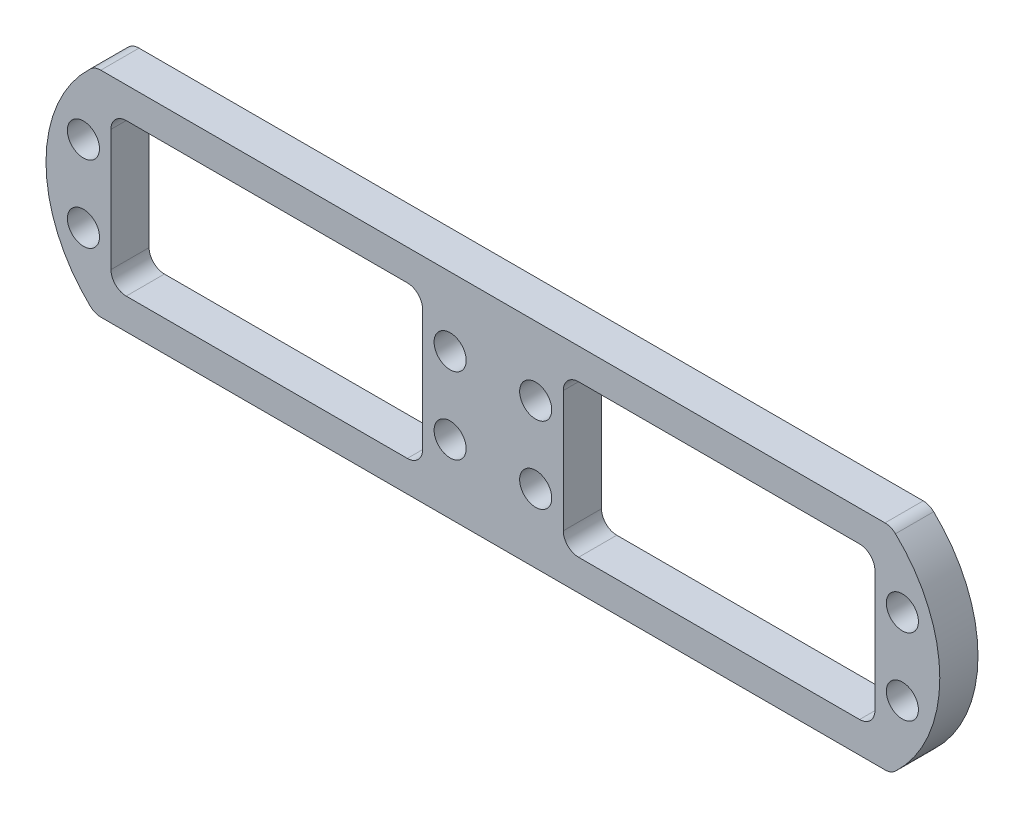
ISO-10303-21;
HEADER;
FILE_DESCRIPTION(('STEP AP214'),'2;1');
FILE_NAME('part.step','',(''),(''),'','','');
FILE_SCHEMA(('AUTOMOTIVE_DESIGN { 1 0 10303 214 1 1 1 1 }'));
ENDSEC;
DATA;
#1=APPLICATION_CONTEXT('core data for automotive mechanical design processes');
#2=APPLICATION_PROTOCOL_DEFINITION('international standard','automotive_design',2000,#1);
#3=PRODUCT_CONTEXT('',#1,'mechanical');
#4=PRODUCT('Part','Part','',(#3));
#5=PRODUCT_RELATED_PRODUCT_CATEGORY('part','',(#4));
#6=PRODUCT_DEFINITION_FORMATION('','',#4);
#7=PRODUCT_DEFINITION_CONTEXT('part definition',#1,'design');
#8=PRODUCT_DEFINITION('design','',#6,#7);
#9=PRODUCT_DEFINITION_SHAPE('','',#8);
#10=(LENGTH_UNIT() NAMED_UNIT(*) SI_UNIT(.MILLI.,.METRE.));
#11=(NAMED_UNIT(*) PLANE_ANGLE_UNIT() SI_UNIT($,.RADIAN.));
#12=(NAMED_UNIT(*) SI_UNIT($,.STERADIAN.) SOLID_ANGLE_UNIT());
#13=UNCERTAINTY_MEASURE_WITH_UNIT(LENGTH_MEASURE(1.E-05),#10,'distance_accuracy_value','');
#14=(GEOMETRIC_REPRESENTATION_CONTEXT(3) GLOBAL_UNCERTAINTY_ASSIGNED_CONTEXT((#13)) GLOBAL_UNIT_ASSIGNED_CONTEXT((#10,
#11,#12)) REPRESENTATION_CONTEXT('',''));
#15=CARTESIAN_POINT('',(0.,0.,0.));
#16=DIRECTION('',(0.,0.,1.));
#17=DIRECTION('',(1.,0.,0.));
#18=AXIS2_PLACEMENT_3D('',#15,#16,#17);
#19=CARTESIAN_POINT('',(91.3247516529062,-12.,5.));
#20=DIRECTION('',(0.,0.,-1.));
#21=DIRECTION('',(-1.,0.,0.));
#22=AXIS2_PLACEMENT_3D('',#19,#20,#21);
#23=PLANE('',#22);
#24=CARTESIAN_POINT('',(45.6000000000007,5.00000000000006,5.));
#25=DIRECTION('',(0.,0.,1.));
#26=DIRECTION('',(1.,0.,0.));
#27=AXIS2_PLACEMENT_3D('',#24,#25,#26);
#28=CIRCLE('',#27,2.1);
#29=CARTESIAN_POINT('',(47.7000000000007,5.00000000000006,5.));
#30=VERTEX_POINT('',#29);
#31=EDGE_CURVE('E701',#30,#30,#28,.T.);
#32=ORIENTED_EDGE('',*,*,#31,.F.);
#33=EDGE_LOOP('',(#32));
#34=FACE_BOUND('',#33,.T.);
#35=CARTESIAN_POINT('',(93.6000000000007,5.00000000000009,5.));
#36=DIRECTION('',(0.,0.,1.));
#37=DIRECTION('',(1.,0.,0.));
#38=AXIS2_PLACEMENT_3D('',#35,#36,#37);
#39=CIRCLE('',#38,2.1);
#40=CARTESIAN_POINT('',(95.7000000000007,5.00000000000009,5.));
#41=VERTEX_POINT('',#40);
#42=EDGE_CURVE('E713',#41,#41,#39,.T.);
#43=ORIENTED_EDGE('',*,*,#42,.F.);
#44=EDGE_LOOP('',(#43));
#45=FACE_BOUND('',#44,.T.);
#46=CARTESIAN_POINT('',(34.4,5.00000000000001,5.));
#47=DIRECTION('',(0.,0.,1.));
#48=DIRECTION('',(1.,0.,0.));
#49=AXIS2_PLACEMENT_3D('',#46,#47,#48);
#50=CIRCLE('',#49,2.1);
#51=CARTESIAN_POINT('',(36.5,5.00000000000001,5.));
#52=VERTEX_POINT('',#51);
#53=EDGE_CURVE('E725',#52,#52,#50,.T.);
#54=ORIENTED_EDGE('',*,*,#53,.F.);
#55=EDGE_LOOP('',(#54));
#56=FACE_BOUND('',#55,.T.);
#57=CARTESIAN_POINT('',(-13.6,4.99999999999998,5.));
#58=DIRECTION('',(0.,0.,1.));
#59=DIRECTION('',(1.,0.,0.));
#60=AXIS2_PLACEMENT_3D('',#57,#58,#59);
#61=CIRCLE('',#60,2.1);
#62=CARTESIAN_POINT('',(-11.5,4.99999999999998,5.));
#63=VERTEX_POINT('',#62);
#64=EDGE_CURVE('E229',#63,#63,#61,.T.);
#65=ORIENTED_EDGE('',*,*,#64,.F.);
#66=EDGE_LOOP('',(#65));
#67=FACE_BOUND('',#66,.T.);
#68=CARTESIAN_POINT('',(51.2153950105849,-7.94999999999999,5.));
#69=DIRECTION('',(0.,0.,1.));
#70=DIRECTION('',(1.,0.,0.));
#71=AXIS2_PLACEMENT_3D('',#68,#69,#70);
#72=CIRCLE('',#71,2.);
#73=CARTESIAN_POINT('',(49.2153950105849,-7.94999999999999,5.));
#74=VERTEX_POINT('',#73);
#75=CARTESIAN_POINT('',(51.2153950105849,-9.94999999999999,5.));
#76=VERTEX_POINT('',#75);
#77=EDGE_CURVE('E259',#74,#76,#72,.T.);
#78=ORIENTED_EDGE('',*,*,#77,.F.);
#79=DIRECTION('',(0.,-1.,0.));
#80=VECTOR('',#79,1.);
#81=CARTESIAN_POINT('',(49.2153950105849,7.95,5.));
#82=LINE('',#81,#80);
#83=CARTESIAN_POINT('',(49.2153950105849,7.95,5.));
#84=VERTEX_POINT('',#83);
#85=EDGE_CURVE('E275',#84,#74,#82,.T.);
#86=ORIENTED_EDGE('',*,*,#85,.F.);
#87=CARTESIAN_POINT('',(51.2153950105849,7.95,5.));
#88=DIRECTION('',(0.,0.,1.));
#89=DIRECTION('',(1.,0.,0.));
#90=AXIS2_PLACEMENT_3D('',#87,#88,#89);
#91=CIRCLE('',#90,2.);
#92=CARTESIAN_POINT('',(51.2153950105849,9.95,5.));
#93=VERTEX_POINT('',#92);
#94=EDGE_CURVE('E272',#93,#84,#91,.T.);
#95=ORIENTED_EDGE('',*,*,#94,.F.);
#96=DIRECTION('',(-1.,0.,0.));
#97=VECTOR('',#96,1.);
#98=CARTESIAN_POINT('',(51.2153950105849,9.95,5.));
#99=LINE('',#98,#97);
#100=CARTESIAN_POINT('',(88.0000000000001,9.95,5.));
#101=VERTEX_POINT('',#100);
#102=EDGE_CURVE('E270',#101,#93,#99,.T.);
#103=ORIENTED_EDGE('',*,*,#102,.F.);
#104=CARTESIAN_POINT('',(88.0000000000001,7.95,5.));
#105=DIRECTION('',(0.,0.,1.));
#106=DIRECTION('',(-1.,0.,0.));
#107=AXIS2_PLACEMENT_3D('',#104,#105,#106);
#108=CIRCLE('',#107,2.);
#109=CARTESIAN_POINT('',(90.0000000000001,7.95,5.));
#110=VERTEX_POINT('',#109);
#111=EDGE_CURVE('E268',#110,#101,#108,.T.);
#112=ORIENTED_EDGE('',*,*,#111,.F.);
#113=DIRECTION('',(0.,1.,0.));
#114=VECTOR('',#113,1.);
#115=CARTESIAN_POINT('',(90.0000000000001,7.95,5.));
#116=LINE('',#115,#114);
#117=CARTESIAN_POINT('',(90.0000000000001,-7.94999999999999,5.));
#118=VERTEX_POINT('',#117);
#119=EDGE_CURVE('E266',#118,#110,#116,.T.);
#120=ORIENTED_EDGE('',*,*,#119,.F.);
#121=CARTESIAN_POINT('',(88.0000000000001,-7.94999999999999,5.));
#122=DIRECTION('',(0.,0.,1.));
#123=DIRECTION('',(1.,0.,0.));
#124=AXIS2_PLACEMENT_3D('',#121,#122,#123);
#125=CIRCLE('',#124,2.);
#126=CARTESIAN_POINT('',(88.0000000000001,-9.94999999999999,5.));
#127=VERTEX_POINT('',#126);
#128=EDGE_CURVE('E264',#127,#118,#125,.T.);
#129=ORIENTED_EDGE('',*,*,#128,.F.);
#130=DIRECTION('',(1.,0.,0.));
#131=VECTOR('',#130,1.);
#132=CARTESIAN_POINT('',(51.2153950105849,-9.94999999999999,5.));
#133=LINE('',#132,#131);
#134=EDGE_CURVE('E261',#76,#127,#133,.T.);
#135=ORIENTED_EDGE('',*,*,#134,.F.);
#136=EDGE_LOOP('',(#78,#86,#95,#103,#112,#120,#129,#135));
#137=FACE_BOUND('',#136,.T.);
#138=CARTESIAN_POINT('',(91.3247516529062,-12.,5.));
#139=DIRECTION('',(0.,0.,1.));
#140=DIRECTION('',(-1.,0.,0.));
#141=AXIS2_PLACEMENT_3D('',#138,#139,#140);
#142=CIRCLE('',#141,2.);
#143=CARTESIAN_POINT('',(91.3247516529062,-14.,5.));
#144=VERTEX_POINT('',#143);
#145=CARTESIAN_POINT('',(92.6974488229554,-13.4545454545454,5.));
#146=VERTEX_POINT('',#145);
#147=EDGE_CURVE('E318',#144,#146,#142,.T.);
#148=ORIENTED_EDGE('',*,*,#147,.T.);
#149=CARTESIAN_POINT('',(80.,0.,5.));
#150=DIRECTION('',(0.,0.,1.));
#151=DIRECTION('',(-1.,0.,0.));
#152=AXIS2_PLACEMENT_3D('',#149,#150,#151);
#153=CIRCLE('',#152,18.5);
#154=CARTESIAN_POINT('',(92.6974488229554,13.4545454545454,5.));
#155=VERTEX_POINT('',#154);
#156=EDGE_CURVE('E321',#146,#155,#153,.T.);
#157=ORIENTED_EDGE('',*,*,#156,.T.);
#158=CARTESIAN_POINT('',(91.3247516529062,12.,5.));
#159=DIRECTION('',(0.,0.,1.));
#160=DIRECTION('',(-1.,0.,0.));
#161=AXIS2_PLACEMENT_3D('',#158,#159,#160);
#162=CIRCLE('',#161,2.);
#163=CARTESIAN_POINT('',(91.3247516529062,14.,5.));
#164=VERTEX_POINT('',#163);
#165=EDGE_CURVE('E324',#155,#164,#162,.T.);
#166=ORIENTED_EDGE('',*,*,#165,.T.);
#167=DIRECTION('',(-1.,0.,0.));
#168=VECTOR('',#167,1.);
#169=CARTESIAN_POINT('',(-11.3247516529062,14.,5.));
#170=LINE('',#169,#168);
#171=CARTESIAN_POINT('',(-11.3247516529062,14.,5.));
#172=VERTEX_POINT('',#171);
#173=EDGE_CURVE('E326',#164,#172,#170,.T.);
#174=ORIENTED_EDGE('',*,*,#173,.T.);
#175=CARTESIAN_POINT('',(-11.3247516529062,12.,5.));
#176=DIRECTION('',(0.,0.,1.));
#177=DIRECTION('',(1.,0.,0.));
#178=AXIS2_PLACEMENT_3D('',#175,#176,#177);
#179=CIRCLE('',#178,2.);
#180=CARTESIAN_POINT('',(-12.6974488229554,13.4545454545454,5.));
#181=VERTEX_POINT('',#180);
#182=EDGE_CURVE('E328',#172,#181,#179,.T.);
#183=ORIENTED_EDGE('',*,*,#182,.T.);
#184=CARTESIAN_POINT('',(0.,0.,5.));
#185=DIRECTION('',(0.,0.,1.));
#186=DIRECTION('',(-1.,0.,0.));
#187=AXIS2_PLACEMENT_3D('',#184,#185,#186);
#188=CIRCLE('',#187,18.5);
#189=CARTESIAN_POINT('',(-12.6974488229554,-13.4545454545455,5.));
#190=VERTEX_POINT('',#189);
#191=EDGE_CURVE('E330',#181,#190,#188,.T.);
#192=ORIENTED_EDGE('',*,*,#191,.T.);
#193=CARTESIAN_POINT('',(-11.3247516529061,-12.,5.));
#194=DIRECTION('',(0.,0.,1.));
#195=DIRECTION('',(-1.,0.,0.));
#196=AXIS2_PLACEMENT_3D('',#193,#194,#195);
#197=CIRCLE('',#196,2.);
#198=CARTESIAN_POINT('',(-11.3247516529061,-14.,5.));
#199=VERTEX_POINT('',#198);
#200=EDGE_CURVE('E332',#190,#199,#197,.T.);
#201=ORIENTED_EDGE('',*,*,#200,.T.);
#202=DIRECTION('',(1.,0.,0.));
#203=VECTOR('',#202,1.);
#204=CARTESIAN_POINT('',(91.3247516529062,-14.,5.));
#205=LINE('',#204,#203);
#206=EDGE_CURVE('E334',#199,#144,#205,.T.);
#207=ORIENTED_EDGE('',*,*,#206,.T.);
#208=EDGE_LOOP('',(#148,#157,#166,#174,#183,#192,#201,#207));
#209=FACE_BOUND('',#208,.T.);
#210=CARTESIAN_POINT('',(-7.99999999999995,7.95000000000001,5.));
#211=DIRECTION('',(0.,0.,1.));
#212=DIRECTION('',(1.,0.,0.));
#213=AXIS2_PLACEMENT_3D('',#210,#211,#212);
#214=CIRCLE('',#213,2.);
#215=CARTESIAN_POINT('',(-7.99999999999995,9.95000000000001,5.));
#216=VERTEX_POINT('',#215);
#217=CARTESIAN_POINT('',(-9.99999999999995,7.95000000000001,5.));
#218=VERTEX_POINT('',#217);
#219=EDGE_CURVE('E191',#216,#218,#214,.T.);
#220=ORIENTED_EDGE('',*,*,#219,.F.);
#221=DIRECTION('',(-1.,0.,0.));
#222=VECTOR('',#221,1.);
#223=CARTESIAN_POINT('',(-7.99999999999995,9.95000000000001,5.));
#224=LINE('',#223,#222);
#225=CARTESIAN_POINT('',(28.8,9.95000000000001,5.));
#226=VERTEX_POINT('',#225);
#227=EDGE_CURVE('E226',#226,#216,#224,.T.);
#228=ORIENTED_EDGE('',*,*,#227,.F.);
#229=CARTESIAN_POINT('',(28.8,7.95000000000001,5.));
#230=DIRECTION('',(0.,0.,1.));
#231=DIRECTION('',(-1.,0.,0.));
#232=AXIS2_PLACEMENT_3D('',#229,#230,#231);
#233=CIRCLE('',#232,2.);
#234=CARTESIAN_POINT('',(30.8,7.95000000000001,5.));
#235=VERTEX_POINT('',#234);
#236=EDGE_CURVE('E224',#235,#226,#233,.T.);
#237=ORIENTED_EDGE('',*,*,#236,.F.);
#238=DIRECTION('',(0.,1.,0.));
#239=VECTOR('',#238,1.);
#240=CARTESIAN_POINT('',(30.8,7.95000000000001,5.));
#241=LINE('',#240,#239);
#242=CARTESIAN_POINT('',(30.8,-7.94999999999999,5.));
#243=VERTEX_POINT('',#242);
#244=EDGE_CURVE('E222',#243,#235,#241,.T.);
#245=ORIENTED_EDGE('',*,*,#244,.F.);
#246=CARTESIAN_POINT('',(28.8,-7.94999999999999,5.));
#247=DIRECTION('',(0.,0.,1.));
#248=DIRECTION('',(1.,0.,0.));
#249=AXIS2_PLACEMENT_3D('',#246,#247,#248);
#250=CIRCLE('',#249,2.);
#251=CARTESIAN_POINT('',(28.8,-9.94999999999999,5.));
#252=VERTEX_POINT('',#251);
#253=EDGE_CURVE('E220',#252,#243,#250,.T.);
#254=ORIENTED_EDGE('',*,*,#253,.F.);
#255=DIRECTION('',(1.,0.,0.));
#256=VECTOR('',#255,1.);
#257=CARTESIAN_POINT('',(-7.99999999999995,-9.94999999999999,5.));
#258=LINE('',#257,#256);
#259=CARTESIAN_POINT('',(-7.99999999999995,-9.94999999999999,5.));
#260=VERTEX_POINT('',#259);
#261=EDGE_CURVE('E215',#260,#252,#258,.T.);
#262=ORIENTED_EDGE('',*,*,#261,.F.);
#263=CARTESIAN_POINT('',(-7.99999999999995,-7.94999999999999,5.));
#264=DIRECTION('',(0.,0.,1.));
#265=DIRECTION('',(1.,0.,0.));
#266=AXIS2_PLACEMENT_3D('',#263,#264,#265);
#267=CIRCLE('',#266,2.);
#268=CARTESIAN_POINT('',(-9.99999999999995,-7.94999999999999,5.));
#269=VERTEX_POINT('',#268);
#270=EDGE_CURVE('E213',#269,#260,#267,.T.);
#271=ORIENTED_EDGE('',*,*,#270,.F.);
#272=DIRECTION('',(0.,-1.,0.));
#273=VECTOR('',#272,1.);
#274=CARTESIAN_POINT('',(-9.99999999999995,7.95000000000001,5.));
#275=LINE('',#274,#273);
#276=EDGE_CURVE('E199',#218,#269,#275,.T.);
#277=ORIENTED_EDGE('',*,*,#276,.F.);
#278=EDGE_LOOP('',(#220,#228,#237,#245,#254,#262,#271,#277));
#279=FACE_BOUND('',#278,.T.);
#280=CARTESIAN_POINT('',(45.6000000000007,-4.99999999999996,5.));
#281=DIRECTION('',(0.,0.,1.));
#282=DIRECTION('',(1.,0.,0.));
#283=AXIS2_PLACEMENT_3D('',#280,#281,#282);
#284=CIRCLE('',#283,2.1);
#285=CARTESIAN_POINT('',(47.7000000000007,-4.99999999999996,5.));
#286=VERTEX_POINT('',#285);
#287=EDGE_CURVE('E731',#286,#286,#284,.T.);
#288=ORIENTED_EDGE('',*,*,#287,.F.);
#289=EDGE_LOOP('',(#288));
#290=FACE_BOUND('',#289,.T.);
#291=CARTESIAN_POINT('',(-13.6,-5.00000000000002,5.));
#292=DIRECTION('',(0.,0.,1.));
#293=DIRECTION('',(1.,0.,0.));
#294=AXIS2_PLACEMENT_3D('',#291,#292,#293);
#295=CIRCLE('',#294,2.1);
#296=CARTESIAN_POINT('',(-11.5,-5.00000000000002,5.));
#297=VERTEX_POINT('',#296);
#298=EDGE_CURVE('E719',#297,#297,#295,.T.);
#299=ORIENTED_EDGE('',*,*,#298,.F.);
#300=EDGE_LOOP('',(#299));
#301=FACE_BOUND('',#300,.T.);
#302=CARTESIAN_POINT('',(93.6000000000007,-4.99999999999991,5.));
#303=DIRECTION('',(0.,0.,1.));
#304=DIRECTION('',(1.,0.,0.));
#305=AXIS2_PLACEMENT_3D('',#302,#303,#304);
#306=CIRCLE('',#305,2.1);
#307=CARTESIAN_POINT('',(95.7000000000008,-4.99999999999991,5.));
#308=VERTEX_POINT('',#307);
#309=EDGE_CURVE('E707',#308,#308,#306,.T.);
#310=ORIENTED_EDGE('',*,*,#309,.F.);
#311=EDGE_LOOP('',(#310));
#312=FACE_BOUND('',#311,.T.);
#313=CARTESIAN_POINT('',(34.4,-5.00000000000002,5.));
#314=DIRECTION('',(0.,0.,1.));
#315=DIRECTION('',(1.,0.,0.));
#316=AXIS2_PLACEMENT_3D('',#313,#314,#315);
#317=CIRCLE('',#316,2.1);
#318=CARTESIAN_POINT('',(36.5,-5.00000000000002,5.));
#319=VERTEX_POINT('',#318);
#320=EDGE_CURVE('E692',#319,#319,#317,.T.);
#321=ORIENTED_EDGE('',*,*,#320,.F.);
#322=EDGE_LOOP('',(#321));
#323=FACE_BOUND('',#322,.T.);
#324=ADVANCED_FACE('F30',(#34,#45,#56,#67,#137,#209,#279,#290,#301,#312,#323),#23,.F.);
#325=CARTESIAN_POINT('',(91.3247516529062,-12.,0.));
#326=DIRECTION('',(0.,0.,-1.));
#327=DIRECTION('',(-1.,0.,0.));
#328=AXIS2_PLACEMENT_3D('',#325,#326,#327);
#329=PLANE('',#328);
#330=CARTESIAN_POINT('',(45.6000000000007,5.00000000000006,0.));
#331=DIRECTION('',(0.,0.,1.));
#332=DIRECTION('',(1.,0.,0.));
#333=AXIS2_PLACEMENT_3D('',#330,#331,#332);
#334=CIRCLE('',#333,2.1);
#335=CARTESIAN_POINT('',(47.7000000000007,5.00000000000006,0.));
#336=VERTEX_POINT('',#335);
#337=EDGE_CURVE('E698',#336,#336,#334,.T.);
#338=ORIENTED_EDGE('',*,*,#337,.T.);
#339=EDGE_LOOP('',(#338));
#340=FACE_BOUND('',#339,.T.);
#341=CARTESIAN_POINT('',(93.6000000000007,5.00000000000009,0.));
#342=DIRECTION('',(0.,0.,1.));
#343=DIRECTION('',(1.,0.,0.));
#344=AXIS2_PLACEMENT_3D('',#341,#342,#343);
#345=CIRCLE('',#344,2.1);
#346=CARTESIAN_POINT('',(95.7000000000007,5.00000000000009,0.));
#347=VERTEX_POINT('',#346);
#348=EDGE_CURVE('E710',#347,#347,#345,.T.);
#349=ORIENTED_EDGE('',*,*,#348,.T.);
#350=EDGE_LOOP('',(#349));
#351=FACE_BOUND('',#350,.T.);
#352=CARTESIAN_POINT('',(34.4,5.00000000000001,0.));
#353=DIRECTION('',(0.,0.,1.));
#354=DIRECTION('',(1.,0.,0.));
#355=AXIS2_PLACEMENT_3D('',#352,#353,#354);
#356=CIRCLE('',#355,2.1);
#357=CARTESIAN_POINT('',(36.5,5.00000000000001,0.));
#358=VERTEX_POINT('',#357);
#359=EDGE_CURVE('E722',#358,#358,#356,.T.);
#360=ORIENTED_EDGE('',*,*,#359,.T.);
#361=EDGE_LOOP('',(#360));
#362=FACE_BOUND('',#361,.T.);
#363=CARTESIAN_POINT('',(-13.6,4.99999999999998,0.));
#364=DIRECTION('',(0.,0.,1.));
#365=DIRECTION('',(1.,0.,0.));
#366=AXIS2_PLACEMENT_3D('',#363,#364,#365);
#367=CIRCLE('',#366,2.1);
#368=CARTESIAN_POINT('',(-11.5,4.99999999999998,0.));
#369=VERTEX_POINT('',#368);
#370=EDGE_CURVE('E734',#369,#369,#367,.T.);
#371=ORIENTED_EDGE('',*,*,#370,.T.);
#372=EDGE_LOOP('',(#371));
#373=FACE_BOUND('',#372,.T.);
#374=DIRECTION('',(0.,-1.,0.));
#375=VECTOR('',#374,1.);
#376=CARTESIAN_POINT('',(49.2153950105849,7.95,0.));
#377=LINE('',#376,#375);
#378=CARTESIAN_POINT('',(49.2153950105849,7.95,0.));
#379=VERTEX_POINT('',#378);
#380=CARTESIAN_POINT('',(49.2153950105849,-7.94999999999999,0.));
#381=VERTEX_POINT('',#380);
#382=EDGE_CURVE('E262',#379,#381,#377,.T.);
#383=ORIENTED_EDGE('',*,*,#382,.T.);
#384=CARTESIAN_POINT('',(51.2153950105849,-7.94999999999999,0.));
#385=DIRECTION('',(0.,0.,1.));
#386=DIRECTION('',(1.,0.,0.));
#387=AXIS2_PLACEMENT_3D('',#384,#385,#386);
#388=CIRCLE('',#387,2.);
#389=CARTESIAN_POINT('',(51.2153950105849,-9.94999999999999,0.));
#390=VERTEX_POINT('',#389);
#391=EDGE_CURVE('E207',#381,#390,#388,.T.);
#392=ORIENTED_EDGE('',*,*,#391,.T.);
#393=DIRECTION('',(1.,0.,0.));
#394=VECTOR('',#393,1.);
#395=CARTESIAN_POINT('',(51.2153950105849,-9.94999999999999,0.));
#396=LINE('',#395,#394);
#397=CARTESIAN_POINT('',(88.0000000000001,-9.94999999999999,0.));
#398=VERTEX_POINT('',#397);
#399=EDGE_CURVE('E280',#390,#398,#396,.T.);
#400=ORIENTED_EDGE('',*,*,#399,.T.);
#401=CARTESIAN_POINT('',(88.0000000000001,-7.94999999999999,0.));
#402=DIRECTION('',(0.,0.,1.));
#403=DIRECTION('',(1.,0.,0.));
#404=AXIS2_PLACEMENT_3D('',#401,#402,#403);
#405=CIRCLE('',#404,2.);
#406=CARTESIAN_POINT('',(90.0000000000001,-7.94999999999999,0.));
#407=VERTEX_POINT('',#406);
#408=EDGE_CURVE('E283',#398,#407,#405,.T.);
#409=ORIENTED_EDGE('',*,*,#408,.T.);
#410=DIRECTION('',(0.,1.,0.));
#411=VECTOR('',#410,1.);
#412=CARTESIAN_POINT('',(90.0000000000001,7.95,0.));
#413=LINE('',#412,#411);
#414=CARTESIAN_POINT('',(90.0000000000001,7.95,0.));
#415=VERTEX_POINT('',#414);
#416=EDGE_CURVE('E286',#407,#415,#413,.T.);
#417=ORIENTED_EDGE('',*,*,#416,.T.);
#418=CARTESIAN_POINT('',(88.0000000000001,7.95,0.));
#419=DIRECTION('',(0.,0.,1.));
#420=DIRECTION('',(-1.,0.,0.));
#421=AXIS2_PLACEMENT_3D('',#418,#419,#420);
#422=CIRCLE('',#421,2.);
#423=CARTESIAN_POINT('',(88.0000000000001,9.95,0.));
#424=VERTEX_POINT('',#423);
#425=EDGE_CURVE('E289',#415,#424,#422,.T.);
#426=ORIENTED_EDGE('',*,*,#425,.T.);
#427=DIRECTION('',(-1.,0.,0.));
#428=VECTOR('',#427,1.);
#429=CARTESIAN_POINT('',(51.2153950105849,9.95,0.));
#430=LINE('',#429,#428);
#431=CARTESIAN_POINT('',(51.2153950105849,9.95,0.));
#432=VERTEX_POINT('',#431);
#433=EDGE_CURVE('E292',#424,#432,#430,.T.);
#434=ORIENTED_EDGE('',*,*,#433,.T.);
#435=CARTESIAN_POINT('',(51.2153950105849,7.95,0.));
#436=DIRECTION('',(0.,0.,1.));
#437=DIRECTION('',(1.,0.,0.));
#438=AXIS2_PLACEMENT_3D('',#435,#436,#437);
#439=CIRCLE('',#438,2.);
#440=EDGE_CURVE('E295',#432,#379,#439,.T.);
#441=ORIENTED_EDGE('',*,*,#440,.T.);
#442=EDGE_LOOP('',(#383,#392,#400,#409,#417,#426,#434,#441));
#443=FACE_BOUND('',#442,.T.);
#444=CARTESIAN_POINT('',(91.3247516529062,-12.,0.));
#445=DIRECTION('',(0.,0.,1.));
#446=DIRECTION('',(-1.,0.,0.));
#447=AXIS2_PLACEMENT_3D('',#444,#445,#446);
#448=CIRCLE('',#447,2.);
#449=CARTESIAN_POINT('',(91.3247516529062,-14.,0.));
#450=VERTEX_POINT('',#449);
#451=CARTESIAN_POINT('',(92.6974488229554,-13.4545454545454,0.));
#452=VERTEX_POINT('',#451);
#453=EDGE_CURVE('E317',#450,#452,#448,.T.);
#454=ORIENTED_EDGE('',*,*,#453,.F.);
#455=DIRECTION('',(1.,0.,0.));
#456=VECTOR('',#455,1.);
#457=CARTESIAN_POINT('',(91.3247516529062,-14.,0.));
#458=LINE('',#457,#456);
#459=CARTESIAN_POINT('',(-11.3247516529061,-14.,0.));
#460=VERTEX_POINT('',#459);
#461=EDGE_CURVE('E322',#460,#450,#458,.T.);
#462=ORIENTED_EDGE('',*,*,#461,.F.);
#463=CARTESIAN_POINT('',(-11.3247516529061,-12.,0.));
#464=DIRECTION('',(0.,0.,1.));
#465=DIRECTION('',(-1.,0.,0.));
#466=AXIS2_PLACEMENT_3D('',#463,#464,#465);
#467=CIRCLE('',#466,2.);
#468=CARTESIAN_POINT('',(-12.6974488229554,-13.4545454545455,0.));
#469=VERTEX_POINT('',#468);
#470=EDGE_CURVE('E349',#469,#460,#467,.T.);
#471=ORIENTED_EDGE('',*,*,#470,.F.);
#472=CARTESIAN_POINT('',(0.,0.,0.));
#473=DIRECTION('',(0.,0.,1.));
#474=DIRECTION('',(-1.,0.,0.));
#475=AXIS2_PLACEMENT_3D('',#472,#473,#474);
#476=CIRCLE('',#475,18.5);
#477=CARTESIAN_POINT('',(-12.6974488229554,13.4545454545454,0.));
#478=VERTEX_POINT('',#477);
#479=EDGE_CURVE('E347',#478,#469,#476,.T.);
#480=ORIENTED_EDGE('',*,*,#479,.F.);
#481=CARTESIAN_POINT('',(-11.3247516529062,12.,0.));
#482=DIRECTION('',(0.,0.,1.));
#483=DIRECTION('',(1.,0.,0.));
#484=AXIS2_PLACEMENT_3D('',#481,#482,#483);
#485=CIRCLE('',#484,2.);
#486=CARTESIAN_POINT('',(-11.3247516529062,14.,0.));
#487=VERTEX_POINT('',#486);
#488=EDGE_CURVE('E345',#487,#478,#485,.T.);
#489=ORIENTED_EDGE('',*,*,#488,.F.);
#490=DIRECTION('',(-1.,0.,0.));
#491=VECTOR('',#490,1.);
#492=CARTESIAN_POINT('',(-11.3247516529062,14.,0.));
#493=LINE('',#492,#491);
#494=CARTESIAN_POINT('',(91.3247516529062,14.,0.));
#495=VERTEX_POINT('',#494);
#496=EDGE_CURVE('E343',#495,#487,#493,.T.);
#497=ORIENTED_EDGE('',*,*,#496,.F.);
#498=CARTESIAN_POINT('',(91.3247516529062,12.,0.));
#499=DIRECTION('',(0.,0.,1.));
#500=DIRECTION('',(-1.,0.,0.));
#501=AXIS2_PLACEMENT_3D('',#498,#499,#500);
#502=CIRCLE('',#501,2.);
#503=CARTESIAN_POINT('',(92.6974488229554,13.4545454545454,0.));
#504=VERTEX_POINT('',#503);
#505=EDGE_CURVE('E341',#504,#495,#502,.T.);
#506=ORIENTED_EDGE('',*,*,#505,.F.);
#507=CARTESIAN_POINT('',(80.,0.,0.));
#508=DIRECTION('',(0.,0.,1.));
#509=DIRECTION('',(-1.,0.,0.));
#510=AXIS2_PLACEMENT_3D('',#507,#508,#509);
#511=CIRCLE('',#510,18.5);
#512=EDGE_CURVE('E339',#452,#504,#511,.T.);
#513=ORIENTED_EDGE('',*,*,#512,.F.);
#514=EDGE_LOOP('',(#454,#462,#471,#480,#489,#497,#506,#513));
#515=FACE_BOUND('',#514,.T.);
#516=DIRECTION('',(-1.,0.,0.));
#517=VECTOR('',#516,1.);
#518=CARTESIAN_POINT('',(-7.99999999999995,9.95000000000001,0.));
#519=LINE('',#518,#517);
#520=CARTESIAN_POINT('',(28.8,9.95000000000001,0.));
#521=VERTEX_POINT('',#520);
#522=CARTESIAN_POINT('',(-7.99999999999995,9.95000000000001,0.));
#523=VERTEX_POINT('',#522);
#524=EDGE_CURVE('E200',#521,#523,#519,.T.);
#525=ORIENTED_EDGE('',*,*,#524,.T.);
#526=CARTESIAN_POINT('',(-7.99999999999995,7.95000000000001,0.));
#527=DIRECTION('',(0.,0.,1.));
#528=DIRECTION('',(1.,0.,0.));
#529=AXIS2_PLACEMENT_3D('',#526,#527,#528);
#530=CIRCLE('',#529,2.);
#531=CARTESIAN_POINT('',(-9.99999999999995,7.95000000000001,0.));
#532=VERTEX_POINT('',#531);
#533=EDGE_CURVE('E53',#523,#532,#530,.T.);
#534=ORIENTED_EDGE('',*,*,#533,.T.);
#535=DIRECTION('',(0.,-1.,0.));
#536=VECTOR('',#535,1.);
#537=CARTESIAN_POINT('',(-9.99999999999995,7.95000000000001,0.));
#538=LINE('',#537,#536);
#539=CARTESIAN_POINT('',(-9.99999999999995,-7.94999999999999,0.));
#540=VERTEX_POINT('',#539);
#541=EDGE_CURVE('E206',#532,#540,#538,.T.);
#542=ORIENTED_EDGE('',*,*,#541,.T.);
#543=CARTESIAN_POINT('',(-7.99999999999995,-7.94999999999999,0.));
#544=DIRECTION('',(0.,0.,1.));
#545=DIRECTION('',(1.,0.,0.));
#546=AXIS2_PLACEMENT_3D('',#543,#544,#545);
#547=CIRCLE('',#546,2.);
#548=CARTESIAN_POINT('',(-7.99999999999995,-9.94999999999999,0.));
#549=VERTEX_POINT('',#548);
#550=EDGE_CURVE('E231',#540,#549,#547,.T.);
#551=ORIENTED_EDGE('',*,*,#550,.T.);
#552=DIRECTION('',(1.,0.,0.));
#553=VECTOR('',#552,1.);
#554=CARTESIAN_POINT('',(-7.99999999999995,-9.94999999999999,0.));
#555=LINE('',#554,#553);
#556=CARTESIAN_POINT('',(28.8,-9.94999999999999,0.));
#557=VERTEX_POINT('',#556);
#558=EDGE_CURVE('E234',#549,#557,#555,.T.);
#559=ORIENTED_EDGE('',*,*,#558,.T.);
#560=CARTESIAN_POINT('',(28.8,-7.94999999999999,0.));
#561=DIRECTION('',(0.,0.,1.));
#562=DIRECTION('',(1.,0.,0.));
#563=AXIS2_PLACEMENT_3D('',#560,#561,#562);
#564=CIRCLE('',#563,2.);
#565=CARTESIAN_POINT('',(30.8,-7.94999999999999,0.));
#566=VERTEX_POINT('',#565);
#567=EDGE_CURVE('E237',#557,#566,#564,.T.);
#568=ORIENTED_EDGE('',*,*,#567,.T.);
#569=DIRECTION('',(0.,1.,0.));
#570=VECTOR('',#569,1.);
#571=CARTESIAN_POINT('',(30.8,7.95000000000001,0.));
#572=LINE('',#571,#570);
#573=CARTESIAN_POINT('',(30.8,7.95000000000001,0.));
#574=VERTEX_POINT('',#573);
#575=EDGE_CURVE('E240',#566,#574,#572,.T.);
#576=ORIENTED_EDGE('',*,*,#575,.T.);
#577=CARTESIAN_POINT('',(28.8,7.95000000000001,0.));
#578=DIRECTION('',(0.,0.,1.));
#579=DIRECTION('',(-1.,0.,0.));
#580=AXIS2_PLACEMENT_3D('',#577,#578,#579);
#581=CIRCLE('',#580,2.);
#582=EDGE_CURVE('E243',#574,#521,#581,.T.);
#583=ORIENTED_EDGE('',*,*,#582,.T.);
#584=EDGE_LOOP('',(#525,#534,#542,#551,#559,#568,#576,#583));
#585=FACE_BOUND('',#584,.T.);
#586=CARTESIAN_POINT('',(45.6000000000007,-4.99999999999996,0.));
#587=DIRECTION('',(0.,0.,1.));
#588=DIRECTION('',(1.,0.,0.));
#589=AXIS2_PLACEMENT_3D('',#586,#587,#588);
#590=CIRCLE('',#589,2.1);
#591=CARTESIAN_POINT('',(47.7000000000007,-4.99999999999996,0.));
#592=VERTEX_POINT('',#591);
#593=EDGE_CURVE('E728',#592,#592,#590,.T.);
#594=ORIENTED_EDGE('',*,*,#593,.T.);
#595=EDGE_LOOP('',(#594));
#596=FACE_BOUND('',#595,.T.);
#597=CARTESIAN_POINT('',(-13.6,-5.00000000000002,0.));
#598=DIRECTION('',(0.,0.,1.));
#599=DIRECTION('',(1.,0.,0.));
#600=AXIS2_PLACEMENT_3D('',#597,#598,#599);
#601=CIRCLE('',#600,2.1);
#602=CARTESIAN_POINT('',(-11.5,-5.00000000000002,0.));
#603=VERTEX_POINT('',#602);
#604=EDGE_CURVE('E716',#603,#603,#601,.T.);
#605=ORIENTED_EDGE('',*,*,#604,.T.);
#606=EDGE_LOOP('',(#605));
#607=FACE_BOUND('',#606,.T.);
#608=CARTESIAN_POINT('',(93.6000000000007,-4.99999999999991,0.));
#609=DIRECTION('',(0.,0.,1.));
#610=DIRECTION('',(1.,0.,0.));
#611=AXIS2_PLACEMENT_3D('',#608,#609,#610);
#612=CIRCLE('',#611,2.1);
#613=CARTESIAN_POINT('',(95.7000000000008,-4.99999999999991,0.));
#614=VERTEX_POINT('',#613);
#615=EDGE_CURVE('E704',#614,#614,#612,.T.);
#616=ORIENTED_EDGE('',*,*,#615,.T.);
#617=EDGE_LOOP('',(#616));
#618=FACE_BOUND('',#617,.T.);
#619=CARTESIAN_POINT('',(34.4,-5.00000000000002,0.));
#620=DIRECTION('',(0.,0.,1.));
#621=DIRECTION('',(1.,0.,0.));
#622=AXIS2_PLACEMENT_3D('',#619,#620,#621);
#623=CIRCLE('',#622,2.1);
#624=CARTESIAN_POINT('',(36.5,-5.00000000000002,0.));
#625=VERTEX_POINT('',#624);
#626=EDGE_CURVE('E695',#625,#625,#623,.T.);
#627=ORIENTED_EDGE('',*,*,#626,.T.);
#628=EDGE_LOOP('',(#627));
#629=FACE_BOUND('',#628,.T.);
#630=ADVANCED_FACE('F379',(#340,#351,#362,#373,#443,#515,#585,#596,#607,#618,#629),#329,.T.);
#631=CARTESIAN_POINT('',(91.3247516529062,-12.,5.));
#632=DIRECTION('',(0.,0.,-1.));
#633=DIRECTION('',(-1.,0.,0.));
#634=AXIS2_PLACEMENT_3D('',#631,#632,#633);
#635=CYLINDRICAL_SURFACE('',#634,2.);
#636=ORIENTED_EDGE('',*,*,#453,.T.);
#637=DIRECTION('',(0.,0.,-1.));
#638=VECTOR('',#637,1.);
#639=CARTESIAN_POINT('',(92.6974488229554,-13.4545454545454,5.));
#640=LINE('',#639,#638);
#641=EDGE_CURVE('E11',#146,#452,#640,.T.);
#642=ORIENTED_EDGE('',*,*,#641,.F.);
#643=ORIENTED_EDGE('',*,*,#147,.F.);
#644=DIRECTION('',(0.,0.,-1.));
#645=VECTOR('',#644,1.);
#646=CARTESIAN_POINT('',(91.3247516529062,-14.,5.));
#647=LINE('',#646,#645);
#648=EDGE_CURVE('E336',#144,#450,#647,.T.);
#649=ORIENTED_EDGE('',*,*,#648,.T.);
#650=EDGE_LOOP('',(#636,#642,#643,#649));
#651=FACE_BOUND('',#650,.T.);
#652=ADVANCED_FACE('F32',(#651),#635,.T.);
#653=CARTESIAN_POINT('',(80.,0.,5.));
#654=DIRECTION('',(0.,0.,-1.));
#655=DIRECTION('',(-1.,0.,0.));
#656=AXIS2_PLACEMENT_3D('',#653,#654,#655);
#657=CYLINDRICAL_SURFACE('',#656,18.5);
#658=ORIENTED_EDGE('',*,*,#512,.T.);
#659=DIRECTION('',(0.,0.,-1.));
#660=VECTOR('',#659,1.);
#661=CARTESIAN_POINT('',(92.6974488229554,13.4545454545454,5.));
#662=LINE('',#661,#660);
#663=EDGE_CURVE('E38',#155,#504,#662,.T.);
#664=ORIENTED_EDGE('',*,*,#663,.F.);
#665=ORIENTED_EDGE('',*,*,#156,.F.);
#666=ORIENTED_EDGE('',*,*,#641,.T.);
#667=EDGE_LOOP('',(#658,#664,#665,#666));
#668=FACE_BOUND('',#667,.T.);
#669=ADVANCED_FACE('F396',(#668),#657,.T.);
#670=CARTESIAN_POINT('',(91.3247516529062,12.,5.));
#671=DIRECTION('',(0.,0.,-1.));
#672=DIRECTION('',(-1.,0.,0.));
#673=AXIS2_PLACEMENT_3D('',#670,#671,#672);
#674=CYLINDRICAL_SURFACE('',#673,2.);
#675=ORIENTED_EDGE('',*,*,#505,.T.);
#676=DIRECTION('',(0.,0.,-1.));
#677=VECTOR('',#676,1.);
#678=CARTESIAN_POINT('',(91.3247516529062,14.,5.));
#679=LINE('',#678,#677);
#680=EDGE_CURVE('E366',#164,#495,#679,.T.);
#681=ORIENTED_EDGE('',*,*,#680,.F.);
#682=ORIENTED_EDGE('',*,*,#165,.F.);
#683=ORIENTED_EDGE('',*,*,#663,.T.);
#684=EDGE_LOOP('',(#675,#681,#682,#683));
#685=FACE_BOUND('',#684,.T.);
#686=ADVANCED_FACE('F373',(#685),#674,.T.);
#687=CARTESIAN_POINT('',(-11.3247516529062,14.,5.));
#688=DIRECTION('',(0.,-1.,0.));
#689=DIRECTION('',(0.,0.,-1.));
#690=AXIS2_PLACEMENT_3D('',#687,#688,#689);
#691=PLANE('',#690);
#692=ORIENTED_EDGE('',*,*,#496,.T.);
#693=DIRECTION('',(0.,0.,-1.));
#694=VECTOR('',#693,1.);
#695=CARTESIAN_POINT('',(-11.3247516529062,14.,5.));
#696=LINE('',#695,#694);
#697=EDGE_CURVE('E363',#172,#487,#696,.T.);
#698=ORIENTED_EDGE('',*,*,#697,.F.);
#699=ORIENTED_EDGE('',*,*,#173,.F.);
#700=ORIENTED_EDGE('',*,*,#680,.T.);
#701=EDGE_LOOP('',(#692,#698,#699,#700));
#702=FACE_BOUND('',#701,.T.);
#703=ADVANCED_FACE('F385',(#702),#691,.F.);
#704=CARTESIAN_POINT('',(-11.3247516529062,12.,5.));
#705=DIRECTION('',(0.,0.,-1.));
#706=DIRECTION('',(-1.,0.,0.));
#707=AXIS2_PLACEMENT_3D('',#704,#705,#706);
#708=CYLINDRICAL_SURFACE('',#707,2.);
#709=ORIENTED_EDGE('',*,*,#488,.T.);
#710=DIRECTION('',(0.,0.,-1.));
#711=VECTOR('',#710,1.);
#712=CARTESIAN_POINT('',(-12.6974488229554,13.4545454545454,5.));
#713=LINE('',#712,#711);
#714=EDGE_CURVE('E360',#181,#478,#713,.T.);
#715=ORIENTED_EDGE('',*,*,#714,.F.);
#716=ORIENTED_EDGE('',*,*,#182,.F.);
#717=ORIENTED_EDGE('',*,*,#697,.T.);
#718=EDGE_LOOP('',(#709,#715,#716,#717));
#719=FACE_BOUND('',#718,.T.);
#720=ADVANCED_FACE('F389',(#719),#708,.T.);
#721=CARTESIAN_POINT('',(0.,0.,5.));
#722=DIRECTION('',(0.,0.,-1.));
#723=DIRECTION('',(-1.,0.,0.));
#724=AXIS2_PLACEMENT_3D('',#721,#722,#723);
#725=CYLINDRICAL_SURFACE('',#724,18.5);
#726=ORIENTED_EDGE('',*,*,#479,.T.);
#727=DIRECTION('',(0.,0.,-1.));
#728=VECTOR('',#727,1.);
#729=CARTESIAN_POINT('',(-12.6974488229554,-13.4545454545455,5.));
#730=LINE('',#729,#728);
#731=EDGE_CURVE('E357',#190,#469,#730,.T.);
#732=ORIENTED_EDGE('',*,*,#731,.F.);
#733=ORIENTED_EDGE('',*,*,#191,.F.);
#734=ORIENTED_EDGE('',*,*,#714,.T.);
#735=EDGE_LOOP('',(#726,#732,#733,#734));
#736=FACE_BOUND('',#735,.T.);
#737=ADVANCED_FACE('F409',(#736),#725,.T.);
#738=CARTESIAN_POINT('',(-11.3247516529061,-12.,5.));
#739=DIRECTION('',(0.,0.,-1.));
#740=DIRECTION('',(-1.,0.,0.));
#741=AXIS2_PLACEMENT_3D('',#738,#739,#740);
#742=CYLINDRICAL_SURFACE('',#741,2.);
#743=ORIENTED_EDGE('',*,*,#470,.T.);
#744=DIRECTION('',(0.,0.,-1.));
#745=VECTOR('',#744,1.);
#746=CARTESIAN_POINT('',(-11.3247516529061,-14.,5.));
#747=LINE('',#746,#745);
#748=EDGE_CURVE('E354',#199,#460,#747,.T.);
#749=ORIENTED_EDGE('',*,*,#748,.F.);
#750=ORIENTED_EDGE('',*,*,#200,.F.);
#751=ORIENTED_EDGE('',*,*,#731,.T.);
#752=EDGE_LOOP('',(#743,#749,#750,#751));
#753=FACE_BOUND('',#752,.T.);
#754=ADVANCED_FACE('F407',(#753),#742,.T.);
#755=CARTESIAN_POINT('',(91.3247516529062,-14.,5.));
#756=DIRECTION('',(0.,1.,0.));
#757=DIRECTION('',(-1.,0.,0.));
#758=AXIS2_PLACEMENT_3D('',#755,#756,#757);
#759=PLANE('',#758);
#760=ORIENTED_EDGE('',*,*,#461,.T.);
#761=ORIENTED_EDGE('',*,*,#648,.F.);
#762=ORIENTED_EDGE('',*,*,#206,.F.);
#763=ORIENTED_EDGE('',*,*,#748,.T.);
#764=EDGE_LOOP('',(#760,#761,#762,#763));
#765=FACE_BOUND('',#764,.T.);
#766=ADVANCED_FACE('F402',(#765),#759,.F.);
#767=CARTESIAN_POINT('',(51.2153950105849,-7.94999999999999,5.));
#768=DIRECTION('',(0.,0.,-1.));
#769=DIRECTION('',(-1.,0.,0.));
#770=AXIS2_PLACEMENT_3D('',#767,#768,#769);
#771=CYLINDRICAL_SURFACE('',#770,2.);
#772=ORIENTED_EDGE('',*,*,#391,.F.);
#773=DIRECTION('',(0.,0.,-1.));
#774=VECTOR('',#773,1.);
#775=CARTESIAN_POINT('',(49.2153950105849,-7.94999999999999,5.));
#776=LINE('',#775,#774);
#777=EDGE_CURVE('E277',#74,#381,#776,.T.);
#778=ORIENTED_EDGE('',*,*,#777,.F.);
#779=ORIENTED_EDGE('',*,*,#77,.T.);
#780=DIRECTION('',(0.,0.,-1.));
#781=VECTOR('',#780,1.);
#782=CARTESIAN_POINT('',(51.2153950105849,-9.94999999999999,5.));
#783=LINE('',#782,#781);
#784=EDGE_CURVE('E314',#76,#390,#783,.T.);
#785=ORIENTED_EDGE('',*,*,#784,.T.);
#786=EDGE_LOOP('',(#772,#778,#779,#785));
#787=FACE_BOUND('',#786,.T.);
#788=ADVANCED_FACE('F429',(#787),#771,.F.);
#789=CARTESIAN_POINT('',(51.2153950105849,-9.94999999999999,5.));
#790=DIRECTION('',(0.,1.,0.));
#791=DIRECTION('',(0.,0.,1.));
#792=AXIS2_PLACEMENT_3D('',#789,#790,#791);
#793=PLANE('',#792);
#794=ORIENTED_EDGE('',*,*,#399,.F.);
#795=ORIENTED_EDGE('',*,*,#784,.F.);
#796=ORIENTED_EDGE('',*,*,#134,.T.);
#797=DIRECTION('',(0.,0.,-1.));
#798=VECTOR('',#797,1.);
#799=CARTESIAN_POINT('',(88.0000000000001,-9.94999999999999,5.));
#800=LINE('',#799,#798);
#801=EDGE_CURVE('E312',#127,#398,#800,.T.);
#802=ORIENTED_EDGE('',*,*,#801,.T.);
#803=EDGE_LOOP('',(#794,#795,#796,#802));
#804=FACE_BOUND('',#803,.T.);
#805=ADVANCED_FACE('F436',(#804),#793,.T.);
#806=CARTESIAN_POINT('',(88.0000000000001,-7.94999999999999,5.));
#807=DIRECTION('',(0.,0.,-1.));
#808=DIRECTION('',(-1.,0.,0.));
#809=AXIS2_PLACEMENT_3D('',#806,#807,#808);
#810=CYLINDRICAL_SURFACE('',#809,2.);
#811=ORIENTED_EDGE('',*,*,#408,.F.);
#812=ORIENTED_EDGE('',*,*,#801,.F.);
#813=ORIENTED_EDGE('',*,*,#128,.T.);
#814=DIRECTION('',(0.,0.,-1.));
#815=VECTOR('',#814,1.);
#816=CARTESIAN_POINT('',(90.0000000000001,-7.94999999999999,5.));
#817=LINE('',#816,#815);
#818=EDGE_CURVE('E310',#118,#407,#817,.T.);
#819=ORIENTED_EDGE('',*,*,#818,.T.);
#820=EDGE_LOOP('',(#811,#812,#813,#819));
#821=FACE_BOUND('',#820,.T.);
#822=ADVANCED_FACE('F441',(#821),#810,.F.);
#823=CARTESIAN_POINT('',(90.0000000000001,7.95,5.));
#824=DIRECTION('',(-1.,0.,0.));
#825=DIRECTION('',(0.,0.,1.));
#826=AXIS2_PLACEMENT_3D('',#823,#824,#825);
#827=PLANE('',#826);
#828=ORIENTED_EDGE('',*,*,#416,.F.);
#829=ORIENTED_EDGE('',*,*,#818,.F.);
#830=ORIENTED_EDGE('',*,*,#119,.T.);
#831=DIRECTION('',(0.,0.,-1.));
#832=VECTOR('',#831,1.);
#833=CARTESIAN_POINT('',(90.0000000000001,7.95,5.));
#834=LINE('',#833,#832);
#835=EDGE_CURVE('E308',#110,#415,#834,.T.);
#836=ORIENTED_EDGE('',*,*,#835,.T.);
#837=EDGE_LOOP('',(#828,#829,#830,#836));
#838=FACE_BOUND('',#837,.T.);
#839=ADVANCED_FACE('F468',(#838),#827,.T.);
#840=CARTESIAN_POINT('',(88.0000000000001,7.95,5.));
#841=DIRECTION('',(0.,0.,-1.));
#842=DIRECTION('',(-1.,0.,0.));
#843=AXIS2_PLACEMENT_3D('',#840,#841,#842);
#844=CYLINDRICAL_SURFACE('',#843,2.);
#845=ORIENTED_EDGE('',*,*,#425,.F.);
#846=ORIENTED_EDGE('',*,*,#835,.F.);
#847=ORIENTED_EDGE('',*,*,#111,.T.);
#848=DIRECTION('',(0.,0.,-1.));
#849=VECTOR('',#848,1.);
#850=CARTESIAN_POINT('',(88.0000000000001,9.95,5.));
#851=LINE('',#850,#849);
#852=EDGE_CURVE('E306',#101,#424,#851,.T.);
#853=ORIENTED_EDGE('',*,*,#852,.T.);
#854=EDGE_LOOP('',(#845,#846,#847,#853));
#855=FACE_BOUND('',#854,.T.);
#856=ADVANCED_FACE('F473',(#855),#844,.F.);
#857=CARTESIAN_POINT('',(51.2153950105849,9.95,5.));
#858=DIRECTION('',(0.,-1.,0.));
#859=DIRECTION('',(0.,0.,-1.));
#860=AXIS2_PLACEMENT_3D('',#857,#858,#859);
#861=PLANE('',#860);
#862=ORIENTED_EDGE('',*,*,#433,.F.);
#863=ORIENTED_EDGE('',*,*,#852,.F.);
#864=ORIENTED_EDGE('',*,*,#102,.T.);
#865=DIRECTION('',(0.,0.,-1.));
#866=VECTOR('',#865,1.);
#867=CARTESIAN_POINT('',(51.2153950105849,9.95,5.));
#868=LINE('',#867,#866);
#869=EDGE_CURVE('E304',#93,#432,#868,.T.);
#870=ORIENTED_EDGE('',*,*,#869,.T.);
#871=EDGE_LOOP('',(#862,#863,#864,#870));
#872=FACE_BOUND('',#871,.T.);
#873=ADVANCED_FACE('F476',(#872),#861,.T.);
#874=CARTESIAN_POINT('',(51.2153950105849,7.95,5.));
#875=DIRECTION('',(0.,0.,-1.));
#876=DIRECTION('',(-1.,0.,0.));
#877=AXIS2_PLACEMENT_3D('',#874,#875,#876);
#878=CYLINDRICAL_SURFACE('',#877,2.);
#879=ORIENTED_EDGE('',*,*,#440,.F.);
#880=ORIENTED_EDGE('',*,*,#869,.F.);
#881=ORIENTED_EDGE('',*,*,#94,.T.);
#882=DIRECTION('',(0.,0.,-1.));
#883=VECTOR('',#882,1.);
#884=CARTESIAN_POINT('',(49.2153950105849,7.95,5.));
#885=LINE('',#884,#883);
#886=EDGE_CURVE('E302',#84,#379,#885,.T.);
#887=ORIENTED_EDGE('',*,*,#886,.T.);
#888=EDGE_LOOP('',(#879,#880,#881,#887));
#889=FACE_BOUND('',#888,.T.);
#890=ADVANCED_FACE('F455',(#889),#878,.F.);
#891=CARTESIAN_POINT('',(49.2153950105849,7.95,5.));
#892=DIRECTION('',(1.,0.,0.));
#893=DIRECTION('',(0.,1.,0.));
#894=AXIS2_PLACEMENT_3D('',#891,#892,#893);
#895=PLANE('',#894);
#896=ORIENTED_EDGE('',*,*,#382,.F.);
#897=ORIENTED_EDGE('',*,*,#886,.F.);
#898=ORIENTED_EDGE('',*,*,#85,.T.);
#899=ORIENTED_EDGE('',*,*,#777,.T.);
#900=EDGE_LOOP('',(#896,#897,#898,#899));
#901=FACE_BOUND('',#900,.T.);
#902=ADVANCED_FACE('F449',(#901),#895,.T.);
#903=CARTESIAN_POINT('',(-7.99999999999995,7.95000000000001,5.));
#904=DIRECTION('',(0.,0.,-1.));
#905=DIRECTION('',(-1.,0.,0.));
#906=AXIS2_PLACEMENT_3D('',#903,#904,#905);
#907=CYLINDRICAL_SURFACE('',#906,2.);
#908=ORIENTED_EDGE('',*,*,#533,.F.);
#909=DIRECTION('',(0.,0.,-1.));
#910=VECTOR('',#909,1.);
#911=CARTESIAN_POINT('',(-7.99999999999995,9.95000000000001,5.));
#912=LINE('',#911,#910);
#913=EDGE_CURVE('E195',#216,#523,#912,.T.);
#914=ORIENTED_EDGE('',*,*,#913,.F.);
#915=ORIENTED_EDGE('',*,*,#219,.T.);
#916=DIRECTION('',(0.,0.,-1.));
#917=VECTOR('',#916,1.);
#918=CARTESIAN_POINT('',(-9.99999999999995,7.95000000000001,5.));
#919=LINE('',#918,#917);
#920=EDGE_CURVE('E194',#218,#532,#919,.T.);
#921=ORIENTED_EDGE('',*,*,#920,.T.);
#922=EDGE_LOOP('',(#908,#914,#915,#921));
#923=FACE_BOUND('',#922,.T.);
#924=ADVANCED_FACE('F193',(#923),#907,.F.);
#925=CARTESIAN_POINT('',(-9.99999999999995,7.95000000000001,5.));
#926=DIRECTION('',(1.,0.,0.));
#927=DIRECTION('',(0.,1.,0.));
#928=AXIS2_PLACEMENT_3D('',#925,#926,#927);
#929=PLANE('',#928);
#930=ORIENTED_EDGE('',*,*,#541,.F.);
#931=ORIENTED_EDGE('',*,*,#920,.F.);
#932=ORIENTED_EDGE('',*,*,#276,.T.);
#933=DIRECTION('',(0.,0.,-1.));
#934=VECTOR('',#933,1.);
#935=CARTESIAN_POINT('',(-9.99999999999995,-7.94999999999999,5.));
#936=LINE('',#935,#934);
#937=EDGE_CURVE('E208',#269,#540,#936,.T.);
#938=ORIENTED_EDGE('',*,*,#937,.T.);
#939=EDGE_LOOP('',(#930,#931,#932,#938));
#940=FACE_BOUND('',#939,.T.);
#941=ADVANCED_FACE('F203',(#940),#929,.T.);
#942=CARTESIAN_POINT('',(-7.99999999999995,-7.94999999999999,5.));
#943=DIRECTION('',(0.,0.,-1.));
#944=DIRECTION('',(-1.,0.,0.));
#945=AXIS2_PLACEMENT_3D('',#942,#943,#944);
#946=CYLINDRICAL_SURFACE('',#945,2.);
#947=ORIENTED_EDGE('',*,*,#550,.F.);
#948=ORIENTED_EDGE('',*,*,#937,.F.);
#949=ORIENTED_EDGE('',*,*,#270,.T.);
#950=DIRECTION('',(0.,0.,-1.));
#951=VECTOR('',#950,1.);
#952=CARTESIAN_POINT('',(-7.99999999999995,-9.94999999999999,5.));
#953=LINE('',#952,#951);
#954=EDGE_CURVE('E256',#260,#549,#953,.T.);
#955=ORIENTED_EDGE('',*,*,#954,.T.);
#956=EDGE_LOOP('',(#947,#948,#949,#955));
#957=FACE_BOUND('',#956,.T.);
#958=ADVANCED_FACE('F536',(#957),#946,.F.);
#959=CARTESIAN_POINT('',(-7.99999999999995,-9.94999999999999,5.));
#960=DIRECTION('',(0.,1.,0.));
#961=DIRECTION('',(0.,0.,1.));
#962=AXIS2_PLACEMENT_3D('',#959,#960,#961);
#963=PLANE('',#962);
#964=ORIENTED_EDGE('',*,*,#558,.F.);
#965=ORIENTED_EDGE('',*,*,#954,.F.);
#966=ORIENTED_EDGE('',*,*,#261,.T.);
#967=DIRECTION('',(0.,0.,-1.));
#968=VECTOR('',#967,1.);
#969=CARTESIAN_POINT('',(28.8,-9.94999999999999,5.));
#970=LINE('',#969,#968);
#971=EDGE_CURVE('E254',#252,#557,#970,.T.);
#972=ORIENTED_EDGE('',*,*,#971,.T.);
#973=EDGE_LOOP('',(#964,#965,#966,#972));
#974=FACE_BOUND('',#973,.T.);
#975=ADVANCED_FACE('F545',(#974),#963,.T.);
#976=CARTESIAN_POINT('',(28.8,-7.94999999999999,5.));
#977=DIRECTION('',(0.,0.,-1.));
#978=DIRECTION('',(-1.,0.,0.));
#979=AXIS2_PLACEMENT_3D('',#976,#977,#978);
#980=CYLINDRICAL_SURFACE('',#979,2.);
#981=ORIENTED_EDGE('',*,*,#567,.F.);
#982=ORIENTED_EDGE('',*,*,#971,.F.);
#983=ORIENTED_EDGE('',*,*,#253,.T.);
#984=DIRECTION('',(0.,0.,-1.));
#985=VECTOR('',#984,1.);
#986=CARTESIAN_POINT('',(30.8,-7.94999999999999,5.));
#987=LINE('',#986,#985);
#988=EDGE_CURVE('E252',#243,#566,#987,.T.);
#989=ORIENTED_EDGE('',*,*,#988,.T.);
#990=EDGE_LOOP('',(#981,#982,#983,#989));
#991=FACE_BOUND('',#990,.T.);
#992=ADVANCED_FACE('F555',(#991),#980,.F.);
#993=CARTESIAN_POINT('',(30.8,7.95000000000001,5.));
#994=DIRECTION('',(-1.,0.,0.));
#995=DIRECTION('',(0.,-1.,0.));
#996=AXIS2_PLACEMENT_3D('',#993,#994,#995);
#997=PLANE('',#996);
#998=ORIENTED_EDGE('',*,*,#575,.F.);
#999=ORIENTED_EDGE('',*,*,#988,.F.);
#1000=ORIENTED_EDGE('',*,*,#244,.T.);
#1001=DIRECTION('',(0.,0.,-1.));
#1002=VECTOR('',#1001,1.);
#1003=CARTESIAN_POINT('',(30.8,7.95000000000001,5.));
#1004=LINE('',#1003,#1002);
#1005=EDGE_CURVE('E250',#235,#574,#1004,.T.);
#1006=ORIENTED_EDGE('',*,*,#1005,.T.);
#1007=EDGE_LOOP('',(#998,#999,#1000,#1006));
#1008=FACE_BOUND('',#1007,.T.);
#1009=ADVANCED_FACE('F565',(#1008),#997,.T.);
#1010=CARTESIAN_POINT('',(28.8,7.95000000000001,5.));
#1011=DIRECTION('',(0.,0.,-1.));
#1012=DIRECTION('',(-1.,0.,0.));
#1013=AXIS2_PLACEMENT_3D('',#1010,#1011,#1012);
#1014=CYLINDRICAL_SURFACE('',#1013,2.);
#1015=ORIENTED_EDGE('',*,*,#582,.F.);
#1016=ORIENTED_EDGE('',*,*,#1005,.F.);
#1017=ORIENTED_EDGE('',*,*,#236,.T.);
#1018=DIRECTION('',(0.,0.,-1.));
#1019=VECTOR('',#1018,1.);
#1020=CARTESIAN_POINT('',(28.8,9.95000000000001,5.));
#1021=LINE('',#1020,#1019);
#1022=EDGE_CURVE('E45',#226,#521,#1021,.T.);
#1023=ORIENTED_EDGE('',*,*,#1022,.T.);
#1024=EDGE_LOOP('',(#1015,#1016,#1017,#1023));
#1025=FACE_BOUND('',#1024,.T.);
#1026=ADVANCED_FACE('F575',(#1025),#1014,.F.);
#1027=CARTESIAN_POINT('',(-7.99999999999995,9.95000000000001,5.));
#1028=DIRECTION('',(0.,-1.,0.));
#1029=DIRECTION('',(0.,0.,-1.));
#1030=AXIS2_PLACEMENT_3D('',#1027,#1028,#1029);
#1031=PLANE('',#1030);
#1032=ORIENTED_EDGE('',*,*,#524,.F.);
#1033=ORIENTED_EDGE('',*,*,#1022,.F.);
#1034=ORIENTED_EDGE('',*,*,#227,.T.);
#1035=ORIENTED_EDGE('',*,*,#913,.T.);
#1036=EDGE_LOOP('',(#1032,#1033,#1034,#1035));
#1037=FACE_BOUND('',#1036,.T.);
#1038=ADVANCED_FACE('F585',(#1037),#1031,.T.);
#1039=CARTESIAN_POINT('',(-13.6,4.99999999999998,5.));
#1040=DIRECTION('',(0.,0.,-1.));
#1041=DIRECTION('',(-1.,0.,0.));
#1042=AXIS2_PLACEMENT_3D('',#1039,#1040,#1041);
#1043=CYLINDRICAL_SURFACE('',#1042,2.1);
#1044=ORIENTED_EDGE('',*,*,#64,.T.);
#1045=EDGE_LOOP('',(#1044));
#1046=FACE_BOUND('',#1045,.T.);
#1047=ORIENTED_EDGE('',*,*,#370,.F.);
#1048=EDGE_LOOP('',(#1047));
#1049=FACE_BOUND('',#1048,.T.);
#1050=ADVANCED_FACE('F594',(#1046,#1049),#1043,.F.);
#1051=CARTESIAN_POINT('',(45.6000000000007,-4.99999999999996,5.));
#1052=DIRECTION('',(0.,0.,-1.));
#1053=DIRECTION('',(-1.,0.,0.));
#1054=AXIS2_PLACEMENT_3D('',#1051,#1052,#1053);
#1055=CYLINDRICAL_SURFACE('',#1054,2.1);
#1056=ORIENTED_EDGE('',*,*,#287,.T.);
#1057=EDGE_LOOP('',(#1056));
#1058=FACE_BOUND('',#1057,.T.);
#1059=ORIENTED_EDGE('',*,*,#593,.F.);
#1060=EDGE_LOOP('',(#1059));
#1061=FACE_BOUND('',#1060,.T.);
#1062=ADVANCED_FACE('F615',(#1058,#1061),#1055,.F.);
#1063=CARTESIAN_POINT('',(34.4,5.00000000000001,5.));
#1064=DIRECTION('',(0.,0.,-1.));
#1065=DIRECTION('',(-1.,0.,0.));
#1066=AXIS2_PLACEMENT_3D('',#1063,#1064,#1065);
#1067=CYLINDRICAL_SURFACE('',#1066,2.1);
#1068=ORIENTED_EDGE('',*,*,#53,.T.);
#1069=EDGE_LOOP('',(#1068));
#1070=FACE_BOUND('',#1069,.T.);
#1071=ORIENTED_EDGE('',*,*,#359,.F.);
#1072=EDGE_LOOP('',(#1071));
#1073=FACE_BOUND('',#1072,.T.);
#1074=ADVANCED_FACE('F625',(#1070,#1073),#1067,.F.);
#1075=CARTESIAN_POINT('',(-13.6,-5.00000000000002,5.));
#1076=DIRECTION('',(0.,0.,-1.));
#1077=DIRECTION('',(-1.,0.,0.));
#1078=AXIS2_PLACEMENT_3D('',#1075,#1076,#1077);
#1079=CYLINDRICAL_SURFACE('',#1078,2.1);
#1080=ORIENTED_EDGE('',*,*,#298,.T.);
#1081=EDGE_LOOP('',(#1080));
#1082=FACE_BOUND('',#1081,.T.);
#1083=ORIENTED_EDGE('',*,*,#604,.F.);
#1084=EDGE_LOOP('',(#1083));
#1085=FACE_BOUND('',#1084,.T.);
#1086=ADVANCED_FACE('F635',(#1082,#1085),#1079,.F.);
#1087=CARTESIAN_POINT('',(93.6000000000007,5.00000000000009,5.));
#1088=DIRECTION('',(0.,0.,-1.));
#1089=DIRECTION('',(-1.,0.,0.));
#1090=AXIS2_PLACEMENT_3D('',#1087,#1088,#1089);
#1091=CYLINDRICAL_SURFACE('',#1090,2.1);
#1092=ORIENTED_EDGE('',*,*,#42,.T.);
#1093=EDGE_LOOP('',(#1092));
#1094=FACE_BOUND('',#1093,.T.);
#1095=ORIENTED_EDGE('',*,*,#348,.F.);
#1096=EDGE_LOOP('',(#1095));
#1097=FACE_BOUND('',#1096,.T.);
#1098=ADVANCED_FACE('F645',(#1094,#1097),#1091,.F.);
#1099=CARTESIAN_POINT('',(93.6000000000007,-4.99999999999991,5.));
#1100=DIRECTION('',(0.,0.,-1.));
#1101=DIRECTION('',(-1.,0.,0.));
#1102=AXIS2_PLACEMENT_3D('',#1099,#1100,#1101);
#1103=CYLINDRICAL_SURFACE('',#1102,2.1);
#1104=ORIENTED_EDGE('',*,*,#309,.T.);
#1105=EDGE_LOOP('',(#1104));
#1106=FACE_BOUND('',#1105,.T.);
#1107=ORIENTED_EDGE('',*,*,#615,.F.);
#1108=EDGE_LOOP('',(#1107));
#1109=FACE_BOUND('',#1108,.T.);
#1110=ADVANCED_FACE('F655',(#1106,#1109),#1103,.F.);
#1111=CARTESIAN_POINT('',(45.6000000000007,5.00000000000006,5.));
#1112=DIRECTION('',(0.,0.,-1.));
#1113=DIRECTION('',(-1.,0.,0.));
#1114=AXIS2_PLACEMENT_3D('',#1111,#1112,#1113);
#1115=CYLINDRICAL_SURFACE('',#1114,2.1);
#1116=ORIENTED_EDGE('',*,*,#31,.T.);
#1117=EDGE_LOOP('',(#1116));
#1118=FACE_BOUND('',#1117,.T.);
#1119=ORIENTED_EDGE('',*,*,#337,.F.);
#1120=EDGE_LOOP('',(#1119));
#1121=FACE_BOUND('',#1120,.T.);
#1122=ADVANCED_FACE('F665',(#1118,#1121),#1115,.F.);
#1123=CARTESIAN_POINT('',(34.4,-5.00000000000002,5.));
#1124=DIRECTION('',(0.,0.,-1.));
#1125=DIRECTION('',(-1.,0.,0.));
#1126=AXIS2_PLACEMENT_3D('',#1123,#1124,#1125);
#1127=CYLINDRICAL_SURFACE('',#1126,2.1);
#1128=ORIENTED_EDGE('',*,*,#320,.T.);
#1129=EDGE_LOOP('',(#1128));
#1130=FACE_BOUND('',#1129,.T.);
#1131=ORIENTED_EDGE('',*,*,#626,.F.);
#1132=EDGE_LOOP('',(#1131));
#1133=FACE_BOUND('',#1132,.T.);
#1134=ADVANCED_FACE('F675',(#1130,#1133),#1127,.F.);
#1135=CLOSED_SHELL('',(#324,#630,#652,#669,#686,#703,#720,#737,#754,#766,#788,#805,#822,#839,
#856,#873,#890,#902,#924,#941,#958,#975,#992,#1009,#1026,#1038,#1050,#1062,#1074,#1086,#1098,
#1110,#1122,#1134));
#1136=MANIFOLD_SOLID_BREP('B2',#1135);
#1137=ADVANCED_BREP_SHAPE_REPRESENTATION('',(#18,#1136),#14);
#1138=SHAPE_DEFINITION_REPRESENTATION(#9,#1137);
ENDSEC;
END-ISO-10303-21;
